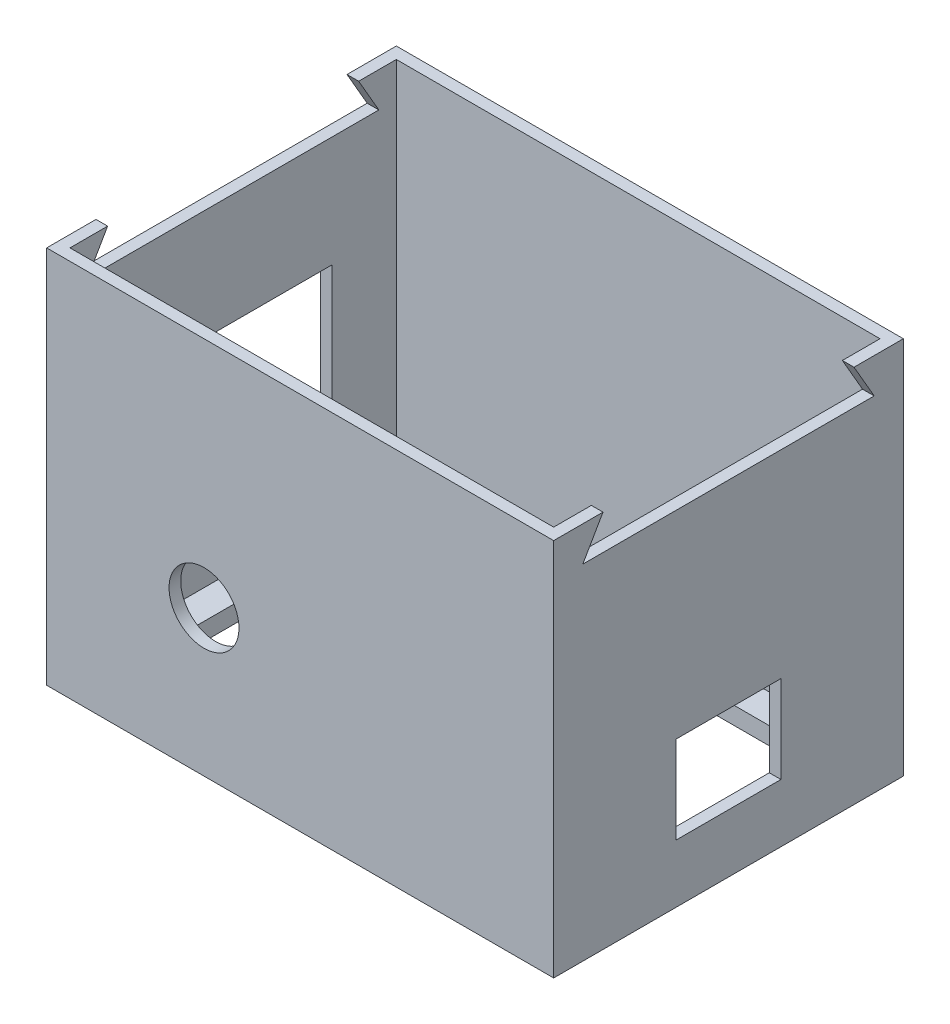
ISO-10303-21;
HEADER;
FILE_DESCRIPTION(('STEP AP214'),'2;1');
FILE_NAME('part.step','',(''),(''),'','','');
FILE_SCHEMA(('AUTOMOTIVE_DESIGN { 1 0 10303 214 1 1 1 1 }'));
ENDSEC;
DATA;
#1=APPLICATION_CONTEXT('core data for automotive mechanical design processes');
#2=APPLICATION_PROTOCOL_DEFINITION('international standard','automotive_design',2000,#1);
#3=PRODUCT_CONTEXT('',#1,'mechanical');
#4=PRODUCT('Part','Part','',(#3));
#5=PRODUCT_RELATED_PRODUCT_CATEGORY('part','',(#4));
#6=PRODUCT_DEFINITION_FORMATION('','',#4);
#7=PRODUCT_DEFINITION_CONTEXT('part definition',#1,'design');
#8=PRODUCT_DEFINITION('design','',#6,#7);
#9=PRODUCT_DEFINITION_SHAPE('','',#8);
#10=(LENGTH_UNIT() NAMED_UNIT(*) SI_UNIT(.MILLI.,.METRE.));
#11=(NAMED_UNIT(*) PLANE_ANGLE_UNIT() SI_UNIT($,.RADIAN.));
#12=(NAMED_UNIT(*) SI_UNIT($,.STERADIAN.) SOLID_ANGLE_UNIT());
#13=UNCERTAINTY_MEASURE_WITH_UNIT(LENGTH_MEASURE(1.E-05),#10,'distance_accuracy_value','');
#14=(GEOMETRIC_REPRESENTATION_CONTEXT(3) GLOBAL_UNCERTAINTY_ASSIGNED_CONTEXT((#13)) GLOBAL_UNIT_ASSIGNED_CONTEXT((#10,
#11,#12)) REPRESENTATION_CONTEXT('',''));
#15=CARTESIAN_POINT('',(0.,0.,0.));
#16=DIRECTION('',(0.,0.,1.));
#17=DIRECTION('',(1.,0.,0.));
#18=AXIS2_PLACEMENT_3D('',#15,#16,#17);
#19=CARTESIAN_POINT('',(0.,65.,0.));
#20=DIRECTION('',(0.,1.,0.));
#21=DIRECTION('',(0.,0.,1.));
#22=AXIS2_PLACEMENT_3D('',#19,#20,#21);
#23=PLANE('',#22);
#24=DIRECTION('',(1.,0.,0.));
#25=VECTOR('',#24,1.);
#26=CARTESIAN_POINT('',(-117.,65.,-51.5358983848622));
#27=LINE('',#26,#25);
#28=CARTESIAN_POINT('',(-2.,65.,-51.5358983848622));
#29=VERTEX_POINT('',#28);
#30=CARTESIAN_POINT('',(0.,65.,-51.5358983848622));
#31=VERTEX_POINT('',#30);
#32=EDGE_CURVE('E272',#29,#31,#27,.T.);
#33=ORIENTED_EDGE('',*,*,#32,.T.);
#34=DIRECTION('',(0.,0.,-1.));
#35=VECTOR('',#34,1.);
#36=CARTESIAN_POINT('',(0.,65.,0.));
#37=LINE('',#36,#35);
#38=CARTESIAN_POINT('',(0.,65.,-60.));
#39=VERTEX_POINT('',#38);
#40=EDGE_CURVE('E427',#31,#39,#37,.T.);
#41=ORIENTED_EDGE('',*,*,#40,.T.);
#42=DIRECTION('',(-1.,0.,0.));
#43=VECTOR('',#42,1.);
#44=CARTESIAN_POINT('',(0.,65.,-60.));
#45=LINE('',#44,#43);
#46=CARTESIAN_POINT('',(-87.,65.,-60.));
#47=VERTEX_POINT('',#46);
#48=EDGE_CURVE('E426',#39,#47,#45,.T.);
#49=ORIENTED_EDGE('',*,*,#48,.T.);
#50=DIRECTION('',(0.,0.,1.));
#51=VECTOR('',#50,1.);
#52=CARTESIAN_POINT('',(-87.,65.,0.));
#53=LINE('',#52,#51);
#54=CARTESIAN_POINT('',(-87.,65.,-51.5358983848622));
#55=VERTEX_POINT('',#54);
#56=EDGE_CURVE('E431',#47,#55,#53,.T.);
#57=ORIENTED_EDGE('',*,*,#56,.T.);
#58=CARTESIAN_POINT('',(-85.,65.,-51.5358983848622));
#59=VERTEX_POINT('',#58);
#60=EDGE_CURVE('E276',#55,#59,#27,.T.);
#61=ORIENTED_EDGE('',*,*,#60,.T.);
#62=DIRECTION('',(0.,0.,1.));
#63=VECTOR('',#62,1.);
#64=CARTESIAN_POINT('',(-85.,65.,-1.99999999999998));
#65=LINE('',#64,#63);
#66=CARTESIAN_POINT('',(-85.,65.,-58.));
#67=VERTEX_POINT('',#66);
#68=EDGE_CURVE('E401',#67,#59,#65,.T.);
#69=ORIENTED_EDGE('',*,*,#68,.F.);
#70=DIRECTION('',(-1.,0.,0.));
#71=VECTOR('',#70,1.);
#72=CARTESIAN_POINT('',(-2.,65.,-58.));
#73=LINE('',#72,#71);
#74=CARTESIAN_POINT('',(-2.,65.,-58.));
#75=VERTEX_POINT('',#74);
#76=EDGE_CURVE('E396',#75,#67,#73,.T.);
#77=ORIENTED_EDGE('',*,*,#76,.F.);
#78=DIRECTION('',(0.,0.,-1.));
#79=VECTOR('',#78,1.);
#80=CARTESIAN_POINT('',(-2.,65.,-1.99999999999999));
#81=LINE('',#80,#79);
#82=EDGE_CURVE('E364',#29,#75,#81,.T.);
#83=ORIENTED_EDGE('',*,*,#82,.F.);
#84=EDGE_LOOP('',(#33,#41,#49,#57,#61,#69,#77,#83));
#85=FACE_BOUND('',#84,.T.);
#86=ADVANCED_FACE('F38',(#85),#23,.T.);
#87=CARTESIAN_POINT('',(0.,65.,0.));
#88=DIRECTION('',(-1.,0.,0.));
#89=DIRECTION('',(0.,0.,1.));
#90=AXIS2_PLACEMENT_3D('',#87,#88,#89);
#91=PLANE('',#90);
#92=DIRECTION('',(0.,0.,1.));
#93=VECTOR('',#92,1.);
#94=CARTESIAN_POINT('',(0.,25.,-39.));
#95=LINE('',#94,#93);
#96=CARTESIAN_POINT('',(0.,25.,-39.));
#97=VERTEX_POINT('',#96);
#98=CARTESIAN_POINT('',(0.,25.,-21.));
#99=VERTEX_POINT('',#98);
#100=EDGE_CURVE('E348',#97,#99,#95,.T.);
#101=ORIENTED_EDGE('',*,*,#100,.F.);
#102=DIRECTION('',(0.,1.,0.));
#103=VECTOR('',#102,1.);
#104=CARTESIAN_POINT('',(0.,10.,-39.));
#105=LINE('',#104,#103);
#106=CARTESIAN_POINT('',(0.,10.,-39.));
#107=VERTEX_POINT('',#106);
#108=EDGE_CURVE('E345',#107,#97,#105,.T.);
#109=ORIENTED_EDGE('',*,*,#108,.F.);
#110=DIRECTION('',(0.,0.,-1.));
#111=VECTOR('',#110,1.);
#112=CARTESIAN_POINT('',(0.,10.,-39.));
#113=LINE('',#112,#111);
#114=CARTESIAN_POINT('',(0.,10.,-21.));
#115=VERTEX_POINT('',#114);
#116=EDGE_CURVE('E356',#115,#107,#113,.T.);
#117=ORIENTED_EDGE('',*,*,#116,.F.);
#118=DIRECTION('',(0.,-1.,0.));
#119=VECTOR('',#118,1.);
#120=CARTESIAN_POINT('',(0.,10.,-21.));
#121=LINE('',#120,#119);
#122=EDGE_CURVE('E352',#99,#115,#121,.T.);
#123=ORIENTED_EDGE('',*,*,#122,.F.);
#124=EDGE_LOOP('',(#101,#109,#117,#123));
#125=FACE_BOUND('',#124,.T.);
#126=ORIENTED_EDGE('',*,*,#40,.F.);
#127=DIRECTION('',(0.,0.866025403784436,0.500000000000004));
#128=VECTOR('',#127,1.);
#129=CARTESIAN_POINT('',(0.,59.,-55.));
#130=LINE('',#129,#128);
#131=CARTESIAN_POINT('',(0.,59.,-55.));
#132=VERTEX_POINT('',#131);
#133=EDGE_CURVE('E268',#132,#31,#130,.T.);
#134=ORIENTED_EDGE('',*,*,#133,.F.);
#135=DIRECTION('',(0.,0.,-1.));
#136=VECTOR('',#135,1.);
#137=CARTESIAN_POINT('',(0.,59.,-5.));
#138=LINE('',#137,#136);
#139=CARTESIAN_POINT('',(0.,59.,-5.));
#140=VERTEX_POINT('',#139);
#141=EDGE_CURVE('E264',#140,#132,#138,.T.);
#142=ORIENTED_EDGE('',*,*,#141,.F.);
#143=DIRECTION('',(0.,-0.866025403784436,0.500000000000004));
#144=VECTOR('',#143,1.);
#145=CARTESIAN_POINT('',(0.,65.,-8.4641016151378));
#146=LINE('',#145,#144);
#147=CARTESIAN_POINT('',(0.,65.,-8.4641016151378));
#148=VERTEX_POINT('',#147);
#149=EDGE_CURVE('E255',#148,#140,#146,.T.);
#150=ORIENTED_EDGE('',*,*,#149,.F.);
#151=CARTESIAN_POINT('',(0.,65.,0.));
#152=VERTEX_POINT('',#151);
#153=EDGE_CURVE('E422',#152,#148,#37,.T.);
#154=ORIENTED_EDGE('',*,*,#153,.F.);
#155=DIRECTION('',(0.,-1.,0.));
#156=VECTOR('',#155,1.);
#157=CARTESIAN_POINT('',(0.,65.,0.));
#158=LINE('',#157,#156);
#159=CARTESIAN_POINT('',(0.,0.,0.));
#160=VERTEX_POINT('',#159);
#161=EDGE_CURVE('E438',#152,#160,#158,.T.);
#162=ORIENTED_EDGE('',*,*,#161,.T.);
#163=DIRECTION('',(0.,0.,-1.));
#164=VECTOR('',#163,1.);
#165=CARTESIAN_POINT('',(0.,0.,0.));
#166=LINE('',#165,#164);
#167=CARTESIAN_POINT('',(0.,0.,-60.));
#168=VERTEX_POINT('',#167);
#169=EDGE_CURVE('E411',#160,#168,#166,.T.);
#170=ORIENTED_EDGE('',*,*,#169,.T.);
#171=DIRECTION('',(0.,-1.,0.));
#172=VECTOR('',#171,1.);
#173=CARTESIAN_POINT('',(0.,65.,-60.));
#174=LINE('',#173,#172);
#175=EDGE_CURVE('E462',#39,#168,#174,.T.);
#176=ORIENTED_EDGE('',*,*,#175,.F.);
#177=EDGE_LOOP('',(#126,#134,#142,#150,#154,#162,#170,#176));
#178=FACE_BOUND('',#177,.T.);
#179=ADVANCED_FACE('F40',(#125,#178),#91,.F.);
#180=CARTESIAN_POINT('',(0.,65.,-60.));
#181=DIRECTION('',(0.,0.,1.));
#182=DIRECTION('',(1.,0.,0.));
#183=AXIS2_PLACEMENT_3D('',#180,#181,#182);
#184=PLANE('',#183);
#185=DIRECTION('',(-1.,0.,0.));
#186=VECTOR('',#185,1.);
#187=CARTESIAN_POINT('',(0.,0.,-60.));
#188=LINE('',#187,#186);
#189=CARTESIAN_POINT('',(-87.,0.,-60.));
#190=VERTEX_POINT('',#189);
#191=EDGE_CURVE('E442',#168,#190,#188,.T.);
#192=ORIENTED_EDGE('',*,*,#191,.T.);
#193=DIRECTION('',(0.,-1.,0.));
#194=VECTOR('',#193,1.);
#195=CARTESIAN_POINT('',(-87.,65.,-60.));
#196=LINE('',#195,#194);
#197=EDGE_CURVE('E458',#47,#190,#196,.T.);
#198=ORIENTED_EDGE('',*,*,#197,.F.);
#199=ORIENTED_EDGE('',*,*,#48,.F.);
#200=ORIENTED_EDGE('',*,*,#175,.T.);
#201=EDGE_LOOP('',(#192,#198,#199,#200));
#202=FACE_BOUND('',#201,.T.);
#203=ADVANCED_FACE('F541',(#202),#184,.F.);
#204=CARTESIAN_POINT('',(-87.,65.,0.));
#205=DIRECTION('',(1.,0.,0.));
#206=DIRECTION('',(0.,0.,-1.));
#207=AXIS2_PLACEMENT_3D('',#204,#205,#206);
#208=PLANE('',#207);
#209=DIRECTION('',(0.,0.,-1.));
#210=VECTOR('',#209,1.);
#211=CARTESIAN_POINT('',(-87.,40.,-13.));
#212=LINE('',#211,#210);
#213=CARTESIAN_POINT('',(-87.,40.,-13.));
#214=VERTEX_POINT('',#213);
#215=CARTESIAN_POINT('',(-87.,40.,-47.));
#216=VERTEX_POINT('',#215);
#217=EDGE_CURVE('E315',#214,#216,#212,.T.);
#218=ORIENTED_EDGE('',*,*,#217,.F.);
#219=DIRECTION('',(0.,1.,0.));
#220=VECTOR('',#219,1.);
#221=CARTESIAN_POINT('',(-87.,40.,-13.));
#222=LINE('',#221,#220);
#223=CARTESIAN_POINT('',(-87.,10.,-13.));
#224=VERTEX_POINT('',#223);
#225=EDGE_CURVE('E312',#224,#214,#222,.T.);
#226=ORIENTED_EDGE('',*,*,#225,.F.);
#227=DIRECTION('',(0.,0.,1.));
#228=VECTOR('',#227,1.);
#229=CARTESIAN_POINT('',(-87.,10.,-13.));
#230=LINE('',#229,#228);
#231=CARTESIAN_POINT('',(-87.,10.,-47.));
#232=VERTEX_POINT('',#231);
#233=EDGE_CURVE('E323',#232,#224,#230,.T.);
#234=ORIENTED_EDGE('',*,*,#233,.F.);
#235=DIRECTION('',(0.,-1.,0.));
#236=VECTOR('',#235,1.);
#237=CARTESIAN_POINT('',(-87.,40.,-47.));
#238=LINE('',#237,#236);
#239=EDGE_CURVE('E319',#216,#232,#238,.T.);
#240=ORIENTED_EDGE('',*,*,#239,.F.);
#241=EDGE_LOOP('',(#218,#226,#234,#240));
#242=FACE_BOUND('',#241,.T.);
#243=DIRECTION('',(0.,0.,-1.));
#244=VECTOR('',#243,1.);
#245=CARTESIAN_POINT('',(-87.,59.,0.));
#246=LINE('',#245,#244);
#247=CARTESIAN_POINT('',(-87.,59.,-5.));
#248=VERTEX_POINT('',#247);
#249=CARTESIAN_POINT('',(-87.,59.,-55.));
#250=VERTEX_POINT('',#249);
#251=EDGE_CURVE('E300',#248,#250,#246,.T.);
#252=ORIENTED_EDGE('',*,*,#251,.T.);
#253=DIRECTION('',(0.,0.866025403784436,0.500000000000005));
#254=VECTOR('',#253,1.);
#255=CARTESIAN_POINT('',(-87.,87.3156986040722,-38.6519237886464));
#256=LINE('',#255,#254);
#257=EDGE_CURVE('E308',#250,#55,#256,.T.);
#258=ORIENTED_EDGE('',*,*,#257,.T.);
#259=ORIENTED_EDGE('',*,*,#56,.F.);
#260=ORIENTED_EDGE('',*,*,#197,.T.);
#261=DIRECTION('',(0.,0.,1.));
#262=VECTOR('',#261,1.);
#263=CARTESIAN_POINT('',(-87.,0.,0.));
#264=LINE('',#263,#262);
#265=CARTESIAN_POINT('',(-87.,0.,0.));
#266=VERTEX_POINT('',#265);
#267=EDGE_CURVE('E445',#190,#266,#264,.T.);
#268=ORIENTED_EDGE('',*,*,#267,.T.);
#269=DIRECTION('',(0.,-1.,0.));
#270=VECTOR('',#269,1.);
#271=CARTESIAN_POINT('',(-87.,65.,0.));
#272=LINE('',#271,#270);
#273=CARTESIAN_POINT('',(-87.,65.,0.));
#274=VERTEX_POINT('',#273);
#275=EDGE_CURVE('E454',#274,#266,#272,.T.);
#276=ORIENTED_EDGE('',*,*,#275,.F.);
#277=CARTESIAN_POINT('',(-87.,65.,-8.4641016151378));
#278=VERTEX_POINT('',#277);
#279=EDGE_CURVE('E430',#278,#274,#53,.T.);
#280=ORIENTED_EDGE('',*,*,#279,.F.);
#281=DIRECTION('',(0.,-0.866025403784436,0.500000000000004));
#282=VECTOR('',#281,1.);
#283=CARTESIAN_POINT('',(-87.,61.3349364905389,-6.34807621135331));
#284=LINE('',#283,#282);
#285=EDGE_CURVE('E292',#278,#248,#284,.T.);
#286=ORIENTED_EDGE('',*,*,#285,.T.);
#287=EDGE_LOOP('',(#252,#258,#259,#260,#268,#276,#280,#286));
#288=FACE_BOUND('',#287,.T.);
#289=ADVANCED_FACE('F553',(#242,#288),#208,.F.);
#290=CARTESIAN_POINT('',(0.,65.,0.));
#291=DIRECTION('',(0.,0.,-1.));
#292=DIRECTION('',(-1.,0.,0.));
#293=AXIS2_PLACEMENT_3D('',#290,#291,#292);
#294=PLANE('',#293);
#295=CARTESIAN_POINT('',(-60.,25.,0.));
#296=DIRECTION('',(0.,0.,1.));
#297=DIRECTION('',(1.,0.,0.));
#298=AXIS2_PLACEMENT_3D('',#295,#296,#297);
#299=CIRCLE('',#298,6.);
#300=CARTESIAN_POINT('',(-54.,25.,0.));
#301=VERTEX_POINT('',#300);
#302=EDGE_CURVE('E331',#301,#301,#299,.T.);
#303=ORIENTED_EDGE('',*,*,#302,.F.);
#304=EDGE_LOOP('',(#303));
#305=FACE_BOUND('',#304,.T.);
#306=DIRECTION('',(1.,0.,0.));
#307=VECTOR('',#306,1.);
#308=CARTESIAN_POINT('',(0.,0.,0.));
#309=LINE('',#308,#307);
#310=EDGE_CURVE('E448',#266,#160,#309,.T.);
#311=ORIENTED_EDGE('',*,*,#310,.T.);
#312=ORIENTED_EDGE('',*,*,#161,.F.);
#313=DIRECTION('',(1.,0.,0.));
#314=VECTOR('',#313,1.);
#315=CARTESIAN_POINT('',(0.,65.,0.));
#316=LINE('',#315,#314);
#317=EDGE_CURVE('E435',#274,#152,#316,.T.);
#318=ORIENTED_EDGE('',*,*,#317,.F.);
#319=ORIENTED_EDGE('',*,*,#275,.T.);
#320=EDGE_LOOP('',(#311,#312,#318,#319));
#321=FACE_BOUND('',#320,.T.);
#322=ADVANCED_FACE('F546',(#305,#321),#294,.F.);
#323=DIRECTION('',(1.,0.,0.));
#324=VECTOR('',#323,1.);
#325=CARTESIAN_POINT('',(-117.,65.,-8.4641016151378));
#326=LINE('',#325,#324);
#327=CARTESIAN_POINT('',(-85.,65.,-8.46410161513781));
#328=VERTEX_POINT('',#327);
#329=EDGE_CURVE('E285',#278,#328,#326,.T.);
#330=ORIENTED_EDGE('',*,*,#329,.F.);
#331=ORIENTED_EDGE('',*,*,#279,.T.);
#332=ORIENTED_EDGE('',*,*,#317,.T.);
#333=ORIENTED_EDGE('',*,*,#153,.T.);
#334=CARTESIAN_POINT('',(-2.,65.,-8.4641016151378));
#335=VERTEX_POINT('',#334);
#336=EDGE_CURVE('E271',#335,#148,#326,.T.);
#337=ORIENTED_EDGE('',*,*,#336,.F.);
#338=CARTESIAN_POINT('',(-2.,65.,-1.99999999999999));
#339=VERTEX_POINT('',#338);
#340=EDGE_CURVE('E392',#339,#335,#81,.T.);
#341=ORIENTED_EDGE('',*,*,#340,.F.);
#342=DIRECTION('',(1.,0.,0.));
#343=VECTOR('',#342,1.);
#344=CARTESIAN_POINT('',(-2.,65.,-1.99999999999999));
#345=LINE('',#344,#343);
#346=CARTESIAN_POINT('',(-85.,65.,-1.99999999999998));
#347=VERTEX_POINT('',#346);
#348=EDGE_CURVE('E379',#347,#339,#345,.T.);
#349=ORIENTED_EDGE('',*,*,#348,.F.);
#350=EDGE_CURVE('E400',#328,#347,#65,.T.);
#351=ORIENTED_EDGE('',*,*,#350,.F.);
#352=EDGE_LOOP('',(#330,#331,#332,#333,#337,#341,#349,#351));
#353=FACE_BOUND('',#352,.T.);
#354=ADVANCED_FACE('F537',(#353),#23,.T.);
#355=CARTESIAN_POINT('',(0.,0.,0.));
#356=DIRECTION('',(0.,1.,0.));
#357=DIRECTION('',(0.,0.,1.));
#358=AXIS2_PLACEMENT_3D('',#355,#356,#357);
#359=PLANE('',#358);
#360=DIRECTION('',(1.,0.,0.));
#361=VECTOR('',#360,1.);
#362=CARTESIAN_POINT('',(0.,0.,-6.99999999999998));
#363=LINE('',#362,#361);
#364=CARTESIAN_POINT('',(-80.,0.,-6.99999999999997));
#365=VERTEX_POINT('',#364);
#366=CARTESIAN_POINT('',(-7.,0.,-6.99999999999998));
#367=VERTEX_POINT('',#366);
#368=EDGE_CURVE('E47',#365,#367,#363,.T.);
#369=ORIENTED_EDGE('',*,*,#368,.T.);
#370=DIRECTION('',(0.,0.,-1.));
#371=VECTOR('',#370,1.);
#372=CARTESIAN_POINT('',(-7.,0.,0.));
#373=LINE('',#372,#371);
#374=CARTESIAN_POINT('',(-7.,0.,-53.));
#375=VERTEX_POINT('',#374);
#376=EDGE_CURVE('E11',#367,#375,#373,.T.);
#377=ORIENTED_EDGE('',*,*,#376,.T.);
#378=DIRECTION('',(-1.,0.,0.));
#379=VECTOR('',#378,1.);
#380=CARTESIAN_POINT('',(0.,0.,-53.));
#381=LINE('',#380,#379);
#382=CARTESIAN_POINT('',(-80.,0.,-53.));
#383=VERTEX_POINT('',#382);
#384=EDGE_CURVE('E229',#375,#383,#381,.T.);
#385=ORIENTED_EDGE('',*,*,#384,.T.);
#386=DIRECTION('',(0.,0.,1.));
#387=VECTOR('',#386,1.);
#388=CARTESIAN_POINT('',(-80.,0.,0.));
#389=LINE('',#388,#387);
#390=EDGE_CURVE('E515',#383,#365,#389,.T.);
#391=ORIENTED_EDGE('',*,*,#390,.T.);
#392=EDGE_LOOP('',(#369,#377,#385,#391));
#393=FACE_BOUND('',#392,.T.);
#394=ORIENTED_EDGE('',*,*,#169,.F.);
#395=ORIENTED_EDGE('',*,*,#310,.F.);
#396=ORIENTED_EDGE('',*,*,#267,.F.);
#397=ORIENTED_EDGE('',*,*,#191,.F.);
#398=EDGE_LOOP('',(#394,#395,#396,#397));
#399=FACE_BOUND('',#398,.T.);
#400=ADVANCED_FACE('F521',(#393,#399),#359,.F.);
#401=CARTESIAN_POINT('',(-2.,3.,-1.99999999999999));
#402=DIRECTION('',(1.,0.,0.));
#403=DIRECTION('',(0.,0.,-1.));
#404=AXIS2_PLACEMENT_3D('',#401,#402,#403);
#405=PLANE('',#404);
#406=DIRECTION('',(0.,0.,-1.));
#407=VECTOR('',#406,1.);
#408=CARTESIAN_POINT('',(-2.,10.,-1.99999999999999));
#409=LINE('',#408,#407);
#410=CARTESIAN_POINT('',(-2.,10.,-21.));
#411=VERTEX_POINT('',#410);
#412=CARTESIAN_POINT('',(-2.,10.,-39.));
#413=VERTEX_POINT('',#412);
#414=EDGE_CURVE('E474',#411,#413,#409,.T.);
#415=ORIENTED_EDGE('',*,*,#414,.T.);
#416=DIRECTION('',(0.,1.,0.));
#417=VECTOR('',#416,1.);
#418=CARTESIAN_POINT('',(-2.,3.,-39.));
#419=LINE('',#418,#417);
#420=CARTESIAN_POINT('',(-2.,25.,-39.));
#421=VERTEX_POINT('',#420);
#422=EDGE_CURVE('E478',#413,#421,#419,.T.);
#423=ORIENTED_EDGE('',*,*,#422,.T.);
#424=DIRECTION('',(0.,0.,1.));
#425=VECTOR('',#424,1.);
#426=CARTESIAN_POINT('',(-2.,25.,-1.99999999999999));
#427=LINE('',#426,#425);
#428=CARTESIAN_POINT('',(-2.,25.,-21.));
#429=VERTEX_POINT('',#428);
#430=EDGE_CURVE('E466',#421,#429,#427,.T.);
#431=ORIENTED_EDGE('',*,*,#430,.T.);
#432=DIRECTION('',(0.,-1.,0.));
#433=VECTOR('',#432,1.);
#434=CARTESIAN_POINT('',(-2.,3.,-21.));
#435=LINE('',#434,#433);
#436=EDGE_CURVE('E470',#429,#411,#435,.T.);
#437=ORIENTED_EDGE('',*,*,#436,.T.);
#438=EDGE_LOOP('',(#415,#423,#431,#437));
#439=FACE_BOUND('',#438,.T.);
#440=DIRECTION('',(0.,0.,-1.));
#441=VECTOR('',#440,1.);
#442=CARTESIAN_POINT('',(-2.,59.,-1.99999999999999));
#443=LINE('',#442,#441);
#444=CARTESIAN_POINT('',(-2.,59.,-5.));
#445=VERTEX_POINT('',#444);
#446=CARTESIAN_POINT('',(-2.,59.,-55.));
#447=VERTEX_POINT('',#446);
#448=EDGE_CURVE('E296',#445,#447,#443,.T.);
#449=ORIENTED_EDGE('',*,*,#448,.T.);
#450=DIRECTION('',(0.,0.866025403784436,0.500000000000005));
#451=VECTOR('',#450,1.);
#452=CARTESIAN_POINT('',(-2.,39.949673200288,-65.9987113059642));
#453=LINE('',#452,#451);
#454=EDGE_CURVE('E304',#447,#29,#453,.T.);
#455=ORIENTED_EDGE('',*,*,#454,.T.);
#456=ORIENTED_EDGE('',*,*,#82,.T.);
#457=DIRECTION('',(0.,1.,0.));
#458=VECTOR('',#457,1.);
#459=CARTESIAN_POINT('',(-2.,3.,-58.));
#460=LINE('',#459,#458);
#461=CARTESIAN_POINT('',(-2.,3.,-58.));
#462=VERTEX_POINT('',#461);
#463=EDGE_CURVE('E391',#462,#75,#460,.T.);
#464=ORIENTED_EDGE('',*,*,#463,.F.);
#465=DIRECTION('',(0.,0.,-1.));
#466=VECTOR('',#465,1.);
#467=CARTESIAN_POINT('',(-2.,3.,-1.99999999999999));
#468=LINE('',#467,#466);
#469=CARTESIAN_POINT('',(-2.,3.,-1.99999999999999));
#470=VERTEX_POINT('',#469);
#471=EDGE_CURVE('E374',#470,#462,#468,.T.);
#472=ORIENTED_EDGE('',*,*,#471,.F.);
#473=DIRECTION('',(0.,1.,0.));
#474=VECTOR('',#473,1.);
#475=CARTESIAN_POINT('',(-2.,3.,-1.99999999999999));
#476=LINE('',#475,#474);
#477=EDGE_CURVE('E408',#470,#339,#476,.T.);
#478=ORIENTED_EDGE('',*,*,#477,.T.);
#479=ORIENTED_EDGE('',*,*,#340,.T.);
#480=DIRECTION('',(0.,-0.866025403784436,0.500000000000004));
#481=VECTOR('',#480,1.);
#482=CARTESIAN_POINT('',(-2.,15.7009618943236,19.9987113059644));
#483=LINE('',#482,#481);
#484=EDGE_CURVE('E288',#335,#445,#483,.T.);
#485=ORIENTED_EDGE('',*,*,#484,.T.);
#486=EDGE_LOOP('',(#449,#455,#456,#464,#472,#478,#479,#485));
#487=FACE_BOUND('',#486,.T.);
#488=ADVANCED_FACE('F552',(#439,#487),#405,.F.);
#489=CARTESIAN_POINT('',(-2.,3.,-1.99999999999999));
#490=DIRECTION('',(0.,0.,1.));
#491=DIRECTION('',(1.,0.,0.));
#492=AXIS2_PLACEMENT_3D('',#489,#490,#491);
#493=PLANE('',#492);
#494=CARTESIAN_POINT('',(-60.,25.,-1.99999999999998));
#495=DIRECTION('',(0.,0.,1.));
#496=DIRECTION('',(1.,0.,0.));
#497=AXIS2_PLACEMENT_3D('',#494,#495,#496);
#498=CIRCLE('',#497,6.);
#499=CARTESIAN_POINT('',(-54.,25.,-1.99999999999998));
#500=VERTEX_POINT('',#499);
#501=EDGE_CURVE('E344',#500,#500,#498,.T.);
#502=ORIENTED_EDGE('',*,*,#501,.T.);
#503=EDGE_LOOP('',(#502));
#504=FACE_BOUND('',#503,.T.);
#505=ORIENTED_EDGE('',*,*,#348,.T.);
#506=ORIENTED_EDGE('',*,*,#477,.F.);
#507=DIRECTION('',(1.,0.,0.));
#508=VECTOR('',#507,1.);
#509=CARTESIAN_POINT('',(-2.,3.,-1.99999999999999));
#510=LINE('',#509,#508);
#511=CARTESIAN_POINT('',(-85.,3.,-1.99999999999998));
#512=VERTEX_POINT('',#511);
#513=EDGE_CURVE('E387',#512,#470,#510,.T.);
#514=ORIENTED_EDGE('',*,*,#513,.F.);
#515=DIRECTION('',(0.,1.,0.));
#516=VECTOR('',#515,1.);
#517=CARTESIAN_POINT('',(-85.,3.,-1.99999999999998));
#518=LINE('',#517,#516);
#519=EDGE_CURVE('E412',#512,#347,#518,.T.);
#520=ORIENTED_EDGE('',*,*,#519,.T.);
#521=EDGE_LOOP('',(#505,#506,#514,#520));
#522=FACE_BOUND('',#521,.T.);
#523=ADVANCED_FACE('F607',(#504,#522),#493,.F.);
#524=CARTESIAN_POINT('',(-85.,3.,-1.99999999999998));
#525=DIRECTION('',(-1.,0.,0.));
#526=DIRECTION('',(0.,0.,1.));
#527=AXIS2_PLACEMENT_3D('',#524,#525,#526);
#528=PLANE('',#527);
#529=DIRECTION('',(0.,0.,1.));
#530=VECTOR('',#529,1.);
#531=CARTESIAN_POINT('',(-85.,10.,-1.99999999999998));
#532=LINE('',#531,#530);
#533=CARTESIAN_POINT('',(-85.,10.,-47.));
#534=VERTEX_POINT('',#533);
#535=CARTESIAN_POINT('',(-85.,10.,-13.));
#536=VERTEX_POINT('',#535);
#537=EDGE_CURVE('E493',#534,#536,#532,.T.);
#538=ORIENTED_EDGE('',*,*,#537,.T.);
#539=DIRECTION('',(0.,1.,0.));
#540=VECTOR('',#539,1.);
#541=CARTESIAN_POINT('',(-85.,3.,-13.));
#542=LINE('',#541,#540);
#543=CARTESIAN_POINT('',(-85.,40.,-13.));
#544=VERTEX_POINT('',#543);
#545=EDGE_CURVE('E497',#536,#544,#542,.T.);
#546=ORIENTED_EDGE('',*,*,#545,.T.);
#547=DIRECTION('',(0.,0.,-1.));
#548=VECTOR('',#547,1.);
#549=CARTESIAN_POINT('',(-85.,40.,-1.99999999999999));
#550=LINE('',#549,#548);
#551=CARTESIAN_POINT('',(-85.,40.,-47.));
#552=VERTEX_POINT('',#551);
#553=EDGE_CURVE('E482',#544,#552,#550,.T.);
#554=ORIENTED_EDGE('',*,*,#553,.T.);
#555=DIRECTION('',(0.,-1.,0.));
#556=VECTOR('',#555,1.);
#557=CARTESIAN_POINT('',(-85.,2.99999999999999,-47.));
#558=LINE('',#557,#556);
#559=EDGE_CURVE('E489',#552,#534,#558,.T.);
#560=ORIENTED_EDGE('',*,*,#559,.T.);
#561=EDGE_LOOP('',(#538,#546,#554,#560));
#562=FACE_BOUND('',#561,.T.);
#563=ORIENTED_EDGE('',*,*,#68,.T.);
#564=DIRECTION('',(0.,-0.866025403784436,-0.500000000000005));
#565=VECTOR('',#564,1.);
#566=CARTESIAN_POINT('',(-85.,39.949673200288,-65.9987113059642));
#567=LINE('',#566,#565);
#568=CARTESIAN_POINT('',(-85.,59.,-55.));
#569=VERTEX_POINT('',#568);
#570=EDGE_CURVE('E509',#59,#569,#567,.T.);
#571=ORIENTED_EDGE('',*,*,#570,.T.);
#572=DIRECTION('',(0.,0.,1.));
#573=VECTOR('',#572,1.);
#574=CARTESIAN_POINT('',(-85.,59.,-1.99999999999998));
#575=LINE('',#574,#573);
#576=CARTESIAN_POINT('',(-85.,59.,-5.));
#577=VERTEX_POINT('',#576);
#578=EDGE_CURVE('E505',#569,#577,#575,.T.);
#579=ORIENTED_EDGE('',*,*,#578,.T.);
#580=DIRECTION('',(0.,0.866025403784436,-0.500000000000004));
#581=VECTOR('',#580,1.);
#582=CARTESIAN_POINT('',(-85.,15.7009618943236,19.9987113059644));
#583=LINE('',#582,#581);
#584=EDGE_CURVE('E501',#577,#328,#583,.T.);
#585=ORIENTED_EDGE('',*,*,#584,.T.);
#586=ORIENTED_EDGE('',*,*,#350,.T.);
#587=ORIENTED_EDGE('',*,*,#519,.F.);
#588=DIRECTION('',(0.,0.,1.));
#589=VECTOR('',#588,1.);
#590=CARTESIAN_POINT('',(-85.,3.,-1.99999999999998));
#591=LINE('',#590,#589);
#592=CARTESIAN_POINT('',(-85.,3.,-58.));
#593=VERTEX_POINT('',#592);
#594=EDGE_CURVE('E383',#593,#512,#591,.T.);
#595=ORIENTED_EDGE('',*,*,#594,.F.);
#596=DIRECTION('',(0.,1.,0.));
#597=VECTOR('',#596,1.);
#598=CARTESIAN_POINT('',(-85.,3.,-58.));
#599=LINE('',#598,#597);
#600=EDGE_CURVE('E416',#593,#67,#599,.T.);
#601=ORIENTED_EDGE('',*,*,#600,.T.);
#602=EDGE_LOOP('',(#563,#571,#579,#585,#586,#587,#595,#601));
#603=FACE_BOUND('',#602,.T.);
#604=ADVANCED_FACE('F580',(#562,#603),#528,.F.);
#605=CARTESIAN_POINT('',(-2.,3.,-58.));
#606=DIRECTION('',(0.,0.,-1.));
#607=DIRECTION('',(-1.,0.,0.));
#608=AXIS2_PLACEMENT_3D('',#605,#606,#607);
#609=PLANE('',#608);
#610=ORIENTED_EDGE('',*,*,#76,.T.);
#611=ORIENTED_EDGE('',*,*,#600,.F.);
#612=DIRECTION('',(-1.,0.,0.));
#613=VECTOR('',#612,1.);
#614=CARTESIAN_POINT('',(-2.,3.,-58.));
#615=LINE('',#614,#613);
#616=EDGE_CURVE('E378',#462,#593,#615,.T.);
#617=ORIENTED_EDGE('',*,*,#616,.F.);
#618=ORIENTED_EDGE('',*,*,#463,.T.);
#619=EDGE_LOOP('',(#610,#611,#617,#618));
#620=FACE_BOUND('',#619,.T.);
#621=ADVANCED_FACE('F611',(#620),#609,.F.);
#622=CARTESIAN_POINT('',(0.,3.,0.));
#623=DIRECTION('',(0.,1.,0.));
#624=DIRECTION('',(0.,0.,1.));
#625=AXIS2_PLACEMENT_3D('',#622,#623,#624);
#626=PLANE('',#625);
#627=DIRECTION('',(0.,0.,-1.));
#628=VECTOR('',#627,1.);
#629=CARTESIAN_POINT('',(-7.,3.,-6.99999999999998));
#630=LINE('',#629,#628);
#631=CARTESIAN_POINT('',(-7.,3.,-6.99999999999998));
#632=VERTEX_POINT('',#631);
#633=CARTESIAN_POINT('',(-7.,3.,-53.));
#634=VERTEX_POINT('',#633);
#635=EDGE_CURVE('E235',#632,#634,#630,.T.);
#636=ORIENTED_EDGE('',*,*,#635,.F.);
#637=DIRECTION('',(1.,0.,0.));
#638=VECTOR('',#637,1.);
#639=CARTESIAN_POINT('',(-7.,3.,-6.99999999999998));
#640=LINE('',#639,#638);
#641=CARTESIAN_POINT('',(-80.,3.,-6.99999999999997));
#642=VERTEX_POINT('',#641);
#643=EDGE_CURVE('E232',#642,#632,#640,.T.);
#644=ORIENTED_EDGE('',*,*,#643,.F.);
#645=DIRECTION('',(0.,0.,1.));
#646=VECTOR('',#645,1.);
#647=CARTESIAN_POINT('',(-80.,3.,-6.99999999999997));
#648=LINE('',#647,#646);
#649=CARTESIAN_POINT('',(-80.,3.,-53.));
#650=VERTEX_POINT('',#649);
#651=EDGE_CURVE('E54',#650,#642,#648,.T.);
#652=ORIENTED_EDGE('',*,*,#651,.F.);
#653=DIRECTION('',(-1.,0.,0.));
#654=VECTOR('',#653,1.);
#655=CARTESIAN_POINT('',(-7.,3.,-53.));
#656=LINE('',#655,#654);
#657=EDGE_CURVE('E227',#634,#650,#656,.T.);
#658=ORIENTED_EDGE('',*,*,#657,.F.);
#659=EDGE_LOOP('',(#636,#644,#652,#658));
#660=FACE_BOUND('',#659,.T.);
#661=ORIENTED_EDGE('',*,*,#471,.T.);
#662=ORIENTED_EDGE('',*,*,#616,.T.);
#663=ORIENTED_EDGE('',*,*,#594,.T.);
#664=ORIENTED_EDGE('',*,*,#513,.T.);
#665=EDGE_LOOP('',(#661,#662,#663,#664));
#666=FACE_BOUND('',#665,.T.);
#667=ADVANCED_FACE('F244',(#660,#666),#626,.T.);
#668=CARTESIAN_POINT('',(-57.,10.,-39.));
#669=DIRECTION('',(0.,0.,-1.));
#670=DIRECTION('',(-1.,0.,0.));
#671=AXIS2_PLACEMENT_3D('',#668,#669,#670);
#672=PLANE('',#671);
#673=DIRECTION('',(1.,0.,0.));
#674=VECTOR('',#673,1.);
#675=CARTESIAN_POINT('',(-57.,10.,-39.));
#676=LINE('',#675,#674);
#677=EDGE_CURVE('E361',#413,#107,#676,.T.);
#678=ORIENTED_EDGE('',*,*,#677,.T.);
#679=ORIENTED_EDGE('',*,*,#108,.T.);
#680=DIRECTION('',(1.,0.,0.));
#681=VECTOR('',#680,1.);
#682=CARTESIAN_POINT('',(-57.,25.,-39.));
#683=LINE('',#682,#681);
#684=EDGE_CURVE('E360',#421,#97,#683,.T.);
#685=ORIENTED_EDGE('',*,*,#684,.F.);
#686=ORIENTED_EDGE('',*,*,#422,.F.);
#687=EDGE_LOOP('',(#678,#679,#685,#686));
#688=FACE_BOUND('',#687,.T.);
#689=ADVANCED_FACE('F667',(#688),#672,.F.);
#690=CARTESIAN_POINT('',(-57.,10.,-39.));
#691=DIRECTION('',(0.,-1.,0.));
#692=DIRECTION('',(0.,0.,-1.));
#693=AXIS2_PLACEMENT_3D('',#690,#691,#692);
#694=PLANE('',#693);
#695=DIRECTION('',(1.,0.,0.));
#696=VECTOR('',#695,1.);
#697=CARTESIAN_POINT('',(-57.,10.,-21.));
#698=LINE('',#697,#696);
#699=EDGE_CURVE('E365',#411,#115,#698,.T.);
#700=ORIENTED_EDGE('',*,*,#699,.T.);
#701=ORIENTED_EDGE('',*,*,#116,.T.);
#702=ORIENTED_EDGE('',*,*,#677,.F.);
#703=ORIENTED_EDGE('',*,*,#414,.F.);
#704=EDGE_LOOP('',(#700,#701,#702,#703));
#705=FACE_BOUND('',#704,.T.);
#706=ADVANCED_FACE('F663',(#705),#694,.F.);
#707=CARTESIAN_POINT('',(-57.,10.,-21.));
#708=DIRECTION('',(0.,0.,1.));
#709=DIRECTION('',(1.,0.,0.));
#710=AXIS2_PLACEMENT_3D('',#707,#708,#709);
#711=PLANE('',#710);
#712=DIRECTION('',(1.,0.,0.));
#713=VECTOR('',#712,1.);
#714=CARTESIAN_POINT('',(-57.,25.,-21.));
#715=LINE('',#714,#713);
#716=EDGE_CURVE('E368',#429,#99,#715,.T.);
#717=ORIENTED_EDGE('',*,*,#716,.T.);
#718=ORIENTED_EDGE('',*,*,#122,.T.);
#719=ORIENTED_EDGE('',*,*,#699,.F.);
#720=ORIENTED_EDGE('',*,*,#436,.F.);
#721=EDGE_LOOP('',(#717,#718,#719,#720));
#722=FACE_BOUND('',#721,.T.);
#723=ADVANCED_FACE('F666',(#722),#711,.F.);
#724=CARTESIAN_POINT('',(-57.,25.,-39.));
#725=DIRECTION('',(0.,1.,0.));
#726=DIRECTION('',(0.,0.,1.));
#727=AXIS2_PLACEMENT_3D('',#724,#725,#726);
#728=PLANE('',#727);
#729=ORIENTED_EDGE('',*,*,#684,.T.);
#730=ORIENTED_EDGE('',*,*,#100,.T.);
#731=ORIENTED_EDGE('',*,*,#716,.F.);
#732=ORIENTED_EDGE('',*,*,#430,.F.);
#733=EDGE_LOOP('',(#729,#730,#731,#732));
#734=FACE_BOUND('',#733,.T.);
#735=ADVANCED_FACE('F661',(#734),#728,.F.);
#736=CARTESIAN_POINT('',(-60.,25.,-24.));
#737=DIRECTION('',(0.,0.,1.));
#738=DIRECTION('',(1.,0.,0.));
#739=AXIS2_PLACEMENT_3D('',#736,#737,#738);
#740=CYLINDRICAL_SURFACE('',#739,6.);
#741=ORIENTED_EDGE('',*,*,#302,.T.);
#742=EDGE_LOOP('',(#741));
#743=FACE_BOUND('',#742,.T.);
#744=ORIENTED_EDGE('',*,*,#501,.F.);
#745=EDGE_LOOP('',(#744));
#746=FACE_BOUND('',#745,.T.);
#747=ADVANCED_FACE('F658',(#743,#746),#740,.F.);
#748=CARTESIAN_POINT('',(-63.,40.,-13.));
#749=DIRECTION('',(0.,0.,1.));
#750=DIRECTION('',(0.,-1.,0.));
#751=AXIS2_PLACEMENT_3D('',#748,#749,#750);
#752=PLANE('',#751);
#753=DIRECTION('',(-1.,0.,0.));
#754=VECTOR('',#753,1.);
#755=CARTESIAN_POINT('',(-63.,10.,-13.));
#756=LINE('',#755,#754);
#757=EDGE_CURVE('E328',#536,#224,#756,.T.);
#758=ORIENTED_EDGE('',*,*,#757,.T.);
#759=ORIENTED_EDGE('',*,*,#225,.T.);
#760=DIRECTION('',(-1.,0.,0.));
#761=VECTOR('',#760,1.);
#762=CARTESIAN_POINT('',(-63.,40.,-13.));
#763=LINE('',#762,#761);
#764=EDGE_CURVE('E327',#544,#214,#763,.T.);
#765=ORIENTED_EDGE('',*,*,#764,.F.);
#766=ORIENTED_EDGE('',*,*,#545,.F.);
#767=EDGE_LOOP('',(#758,#759,#765,#766));
#768=FACE_BOUND('',#767,.T.);
#769=ADVANCED_FACE('F637',(#768),#752,.F.);
#770=CARTESIAN_POINT('',(-63.,10.,-13.));
#771=DIRECTION('',(0.,-1.,0.));
#772=DIRECTION('',(0.,0.,-1.));
#773=AXIS2_PLACEMENT_3D('',#770,#771,#772);
#774=PLANE('',#773);
#775=DIRECTION('',(-1.,0.,0.));
#776=VECTOR('',#775,1.);
#777=CARTESIAN_POINT('',(-63.,10.,-47.));
#778=LINE('',#777,#776);
#779=EDGE_CURVE('E332',#534,#232,#778,.T.);
#780=ORIENTED_EDGE('',*,*,#779,.T.);
#781=ORIENTED_EDGE('',*,*,#233,.T.);
#782=ORIENTED_EDGE('',*,*,#757,.F.);
#783=ORIENTED_EDGE('',*,*,#537,.F.);
#784=EDGE_LOOP('',(#780,#781,#782,#783));
#785=FACE_BOUND('',#784,.T.);
#786=ADVANCED_FACE('F642',(#785),#774,.F.);
#787=CARTESIAN_POINT('',(-63.,40.,-47.));
#788=DIRECTION('',(0.,0.,-1.));
#789=DIRECTION('',(0.,1.,0.));
#790=AXIS2_PLACEMENT_3D('',#787,#788,#789);
#791=PLANE('',#790);
#792=DIRECTION('',(-1.,0.,0.));
#793=VECTOR('',#792,1.);
#794=CARTESIAN_POINT('',(-63.,40.,-47.));
#795=LINE('',#794,#793);
#796=EDGE_CURVE('E335',#552,#216,#795,.T.);
#797=ORIENTED_EDGE('',*,*,#796,.T.);
#798=ORIENTED_EDGE('',*,*,#239,.T.);
#799=ORIENTED_EDGE('',*,*,#779,.F.);
#800=ORIENTED_EDGE('',*,*,#559,.F.);
#801=EDGE_LOOP('',(#797,#798,#799,#800));
#802=FACE_BOUND('',#801,.T.);
#803=ADVANCED_FACE('F644',(#802),#791,.F.);
#804=CARTESIAN_POINT('',(-63.,40.,-13.));
#805=DIRECTION('',(0.,1.,0.));
#806=DIRECTION('',(0.,0.,1.));
#807=AXIS2_PLACEMENT_3D('',#804,#805,#806);
#808=PLANE('',#807);
#809=ORIENTED_EDGE('',*,*,#764,.T.);
#810=ORIENTED_EDGE('',*,*,#217,.T.);
#811=ORIENTED_EDGE('',*,*,#796,.F.);
#812=ORIENTED_EDGE('',*,*,#553,.F.);
#813=EDGE_LOOP('',(#809,#810,#811,#812));
#814=FACE_BOUND('',#813,.T.);
#815=ADVANCED_FACE('F633',(#814),#808,.F.);
#816=CARTESIAN_POINT('',(-117.,65.,-8.4641016151378));
#817=DIRECTION('',(0.,0.500000000000004,0.866025403784436));
#818=DIRECTION('',(0.,-0.866025403784436,0.500000000000004));
#819=AXIS2_PLACEMENT_3D('',#816,#817,#818);
#820=PLANE('',#819);
#821=ORIENTED_EDGE('',*,*,#329,.T.);
#822=ORIENTED_EDGE('',*,*,#584,.F.);
#823=DIRECTION('',(1.,0.,0.));
#824=VECTOR('',#823,1.);
#825=CARTESIAN_POINT('',(-117.,59.,-5.));
#826=LINE('',#825,#824);
#827=EDGE_CURVE('E281',#248,#577,#826,.T.);
#828=ORIENTED_EDGE('',*,*,#827,.F.);
#829=ORIENTED_EDGE('',*,*,#285,.F.);
#830=EDGE_LOOP('',(#821,#822,#828,#829));
#831=FACE_BOUND('',#830,.T.);
#832=ADVANCED_FACE('F651',(#831),#820,.F.);
#833=CARTESIAN_POINT('',(-117.,59.,-5.));
#834=DIRECTION('',(0.,-1.,0.));
#835=DIRECTION('',(0.,0.,-1.));
#836=AXIS2_PLACEMENT_3D('',#833,#834,#835);
#837=PLANE('',#836);
#838=ORIENTED_EDGE('',*,*,#827,.T.);
#839=ORIENTED_EDGE('',*,*,#578,.F.);
#840=DIRECTION('',(1.,0.,0.));
#841=VECTOR('',#840,1.);
#842=CARTESIAN_POINT('',(-117.,59.,-55.));
#843=LINE('',#842,#841);
#844=EDGE_CURVE('E277',#250,#569,#843,.T.);
#845=ORIENTED_EDGE('',*,*,#844,.F.);
#846=ORIENTED_EDGE('',*,*,#251,.F.);
#847=EDGE_LOOP('',(#838,#839,#845,#846));
#848=FACE_BOUND('',#847,.T.);
#849=ADVANCED_FACE('F577',(#848),#837,.F.);
#850=CARTESIAN_POINT('',(-117.,59.,-55.));
#851=DIRECTION('',(0.,0.500000000000004,-0.866025403784436));
#852=DIRECTION('',(0.,0.866025403784436,0.500000000000005));
#853=AXIS2_PLACEMENT_3D('',#850,#851,#852);
#854=PLANE('',#853);
#855=ORIENTED_EDGE('',*,*,#844,.T.);
#856=ORIENTED_EDGE('',*,*,#570,.F.);
#857=ORIENTED_EDGE('',*,*,#60,.F.);
#858=ORIENTED_EDGE('',*,*,#257,.F.);
#859=EDGE_LOOP('',(#855,#856,#857,#858));
#860=FACE_BOUND('',#859,.T.);
#861=ADVANCED_FACE('F583',(#860),#854,.F.);
#862=EDGE_CURVE('E278',#447,#132,#843,.T.);
#863=ORIENTED_EDGE('',*,*,#862,.T.);
#864=ORIENTED_EDGE('',*,*,#133,.T.);
#865=ORIENTED_EDGE('',*,*,#32,.F.);
#866=ORIENTED_EDGE('',*,*,#454,.F.);
#867=EDGE_LOOP('',(#863,#864,#865,#866));
#868=FACE_BOUND('',#867,.T.);
#869=ADVANCED_FACE('F616',(#868),#854,.F.);
#870=EDGE_CURVE('E282',#445,#140,#826,.T.);
#871=ORIENTED_EDGE('',*,*,#870,.T.);
#872=ORIENTED_EDGE('',*,*,#141,.T.);
#873=ORIENTED_EDGE('',*,*,#862,.F.);
#874=ORIENTED_EDGE('',*,*,#448,.F.);
#875=EDGE_LOOP('',(#871,#872,#873,#874));
#876=FACE_BOUND('',#875,.T.);
#877=ADVANCED_FACE('F618',(#876),#837,.F.);
#878=ORIENTED_EDGE('',*,*,#336,.T.);
#879=ORIENTED_EDGE('',*,*,#149,.T.);
#880=ORIENTED_EDGE('',*,*,#870,.F.);
#881=ORIENTED_EDGE('',*,*,#484,.F.);
#882=EDGE_LOOP('',(#878,#879,#880,#881));
#883=FACE_BOUND('',#882,.T.);
#884=ADVANCED_FACE('F812',(#883),#820,.F.);
#885=CARTESIAN_POINT('',(-7.,-7.,-6.99999999999998));
#886=DIRECTION('',(1.,0.,0.));
#887=DIRECTION('',(0.,0.,-1.));
#888=AXIS2_PLACEMENT_3D('',#885,#886,#887);
#889=PLANE('',#888);
#890=DIRECTION('',(0.,1.,0.));
#891=VECTOR('',#890,1.);
#892=CARTESIAN_POINT('',(-7.,-7.,-6.99999999999998));
#893=LINE('',#892,#891);
#894=EDGE_CURVE('E238',#367,#632,#893,.T.);
#895=ORIENTED_EDGE('',*,*,#894,.T.);
#896=ORIENTED_EDGE('',*,*,#635,.T.);
#897=DIRECTION('',(0.,1.,0.));
#898=VECTOR('',#897,1.);
#899=CARTESIAN_POINT('',(-7.,-7.,-53.));
#900=LINE('',#899,#898);
#901=EDGE_CURVE('E223',#375,#634,#900,.T.);
#902=ORIENTED_EDGE('',*,*,#901,.F.);
#903=ORIENTED_EDGE('',*,*,#376,.F.);
#904=EDGE_LOOP('',(#895,#896,#902,#903));
#905=FACE_BOUND('',#904,.T.);
#906=ADVANCED_FACE('F236',(#905),#889,.F.);
#907=CARTESIAN_POINT('',(-7.,-7.,-6.99999999999998));
#908=DIRECTION('',(0.,0.,1.));
#909=DIRECTION('',(1.,0.,0.));
#910=AXIS2_PLACEMENT_3D('',#907,#908,#909);
#911=PLANE('',#910);
#912=DIRECTION('',(0.,1.,0.));
#913=VECTOR('',#912,1.);
#914=CARTESIAN_POINT('',(-80.,-7.,-6.99999999999997));
#915=LINE('',#914,#913);
#916=EDGE_CURVE('E256',#365,#642,#915,.T.);
#917=ORIENTED_EDGE('',*,*,#916,.T.);
#918=ORIENTED_EDGE('',*,*,#643,.T.);
#919=ORIENTED_EDGE('',*,*,#894,.F.);
#920=ORIENTED_EDGE('',*,*,#368,.F.);
#921=EDGE_LOOP('',(#917,#918,#919,#920));
#922=FACE_BOUND('',#921,.T.);
#923=ADVANCED_FACE('F524',(#922),#911,.F.);
#924=CARTESIAN_POINT('',(-80.,-7.,-6.99999999999997));
#925=DIRECTION('',(-1.,0.,0.));
#926=DIRECTION('',(0.,0.,1.));
#927=AXIS2_PLACEMENT_3D('',#924,#925,#926);
#928=PLANE('',#927);
#929=DIRECTION('',(0.,1.,0.));
#930=VECTOR('',#929,1.);
#931=CARTESIAN_POINT('',(-80.,-7.,-53.));
#932=LINE('',#931,#930);
#933=EDGE_CURVE('E61',#383,#650,#932,.T.);
#934=ORIENTED_EDGE('',*,*,#933,.T.);
#935=ORIENTED_EDGE('',*,*,#651,.T.);
#936=ORIENTED_EDGE('',*,*,#916,.F.);
#937=ORIENTED_EDGE('',*,*,#390,.F.);
#938=EDGE_LOOP('',(#934,#935,#936,#937));
#939=FACE_BOUND('',#938,.T.);
#940=ADVANCED_FACE('F525',(#939),#928,.F.);
#941=CARTESIAN_POINT('',(-7.,-7.,-53.));
#942=DIRECTION('',(0.,0.,-1.));
#943=DIRECTION('',(-1.,0.,0.));
#944=AXIS2_PLACEMENT_3D('',#941,#942,#943);
#945=PLANE('',#944);
#946=ORIENTED_EDGE('',*,*,#901,.T.);
#947=ORIENTED_EDGE('',*,*,#657,.T.);
#948=ORIENTED_EDGE('',*,*,#933,.F.);
#949=ORIENTED_EDGE('',*,*,#384,.F.);
#950=EDGE_LOOP('',(#946,#947,#948,#949));
#951=FACE_BOUND('',#950,.T.);
#952=ADVANCED_FACE('F225',(#951),#945,.F.);
#953=CLOSED_SHELL('',(#86,#179,#203,#289,#322,#354,#400,#488,#523,#604,#621,#667,#689,#706,#723,
#735,#747,#769,#786,#803,#815,#832,#849,#861,#869,#877,#884,#906,#923,#940,#952));
#954=MANIFOLD_SOLID_BREP('B2',#953);
#955=ADVANCED_BREP_SHAPE_REPRESENTATION('',(#18,#954),#14);
#956=SHAPE_DEFINITION_REPRESENTATION(#9,#955);
ENDSEC;
END-ISO-10303-21;
